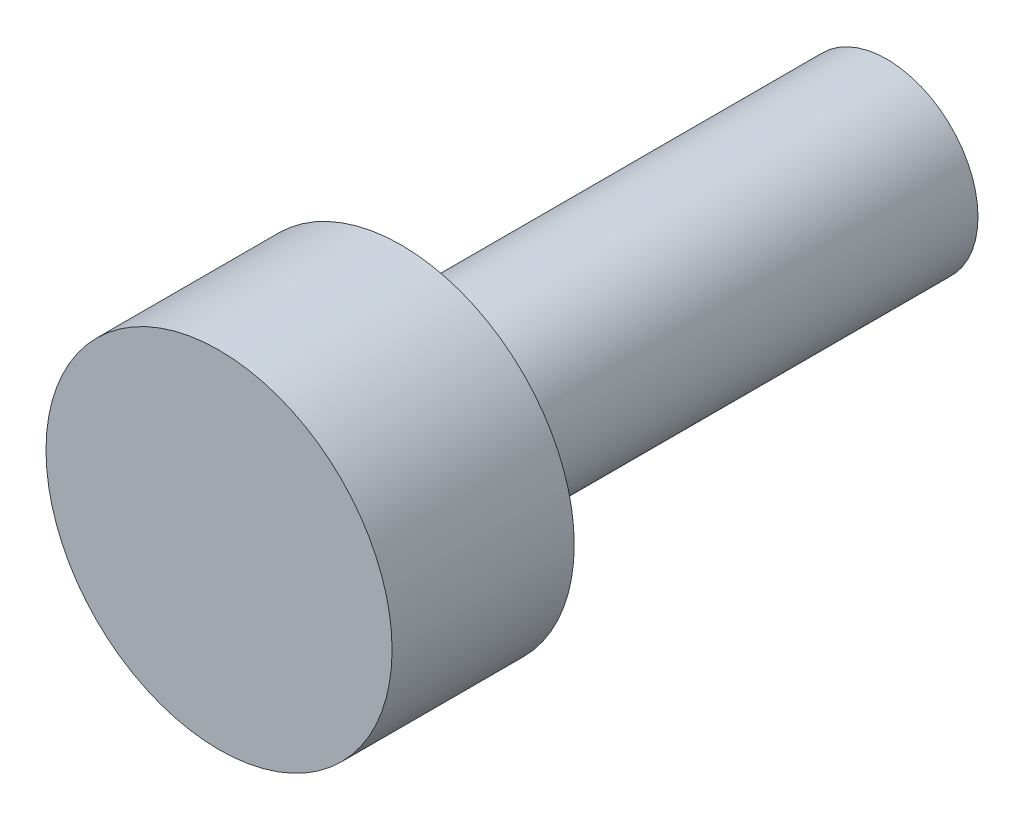
ISO-10303-21;
HEADER;
FILE_DESCRIPTION(('STEP AP214'),'2;1');
FILE_NAME('part.step','',(''),(''),'','','');
FILE_SCHEMA(('AUTOMOTIVE_DESIGN { 1 0 10303 214 1 1 1 1 }'));
ENDSEC;
DATA;
#1=APPLICATION_CONTEXT('core data for automotive mechanical design processes');
#2=APPLICATION_PROTOCOL_DEFINITION('international standard','automotive_design',2000,#1);
#3=PRODUCT_CONTEXT('',#1,'mechanical');
#4=PRODUCT('Part','Part','',(#3));
#5=PRODUCT_RELATED_PRODUCT_CATEGORY('part','',(#4));
#6=PRODUCT_DEFINITION_FORMATION('','',#4);
#7=PRODUCT_DEFINITION_CONTEXT('part definition',#1,'design');
#8=PRODUCT_DEFINITION('design','',#6,#7);
#9=PRODUCT_DEFINITION_SHAPE('','',#8);
#10=(LENGTH_UNIT() NAMED_UNIT(*) SI_UNIT(.MILLI.,.METRE.));
#11=(NAMED_UNIT(*) PLANE_ANGLE_UNIT() SI_UNIT($,.RADIAN.));
#12=(NAMED_UNIT(*) SI_UNIT($,.STERADIAN.) SOLID_ANGLE_UNIT());
#13=UNCERTAINTY_MEASURE_WITH_UNIT(LENGTH_MEASURE(1.E-05),#10,'distance_accuracy_value','');
#14=(GEOMETRIC_REPRESENTATION_CONTEXT(3) GLOBAL_UNCERTAINTY_ASSIGNED_CONTEXT((#13)) GLOBAL_UNIT_ASSIGNED_CONTEXT((#10,
#11,#12)) REPRESENTATION_CONTEXT('',''));
#15=CARTESIAN_POINT('',(0.,0.,0.));
#16=DIRECTION('',(0.,0.,1.));
#17=DIRECTION('',(1.,0.,0.));
#18=AXIS2_PLACEMENT_3D('',#15,#16,#17);
#19=CARTESIAN_POINT('',(0.,0.,8.));
#20=DIRECTION('',(0.,0.,-1.));
#21=DIRECTION('',(-1.,0.,0.));
#22=AXIS2_PLACEMENT_3D('',#19,#20,#21);
#23=CYLINDRICAL_SURFACE('',#22,1.5);
#24=CARTESIAN_POINT('',(0.,0.,8.));
#25=DIRECTION('',(0.,0.,1.));
#26=DIRECTION('',(1.,0.,0.));
#27=AXIS2_PLACEMENT_3D('',#24,#25,#26);
#28=CIRCLE('',#27,1.5);
#29=CARTESIAN_POINT('',(1.5,0.,8.));
#30=VERTEX_POINT('',#29);
#31=EDGE_CURVE('E10',#30,#30,#28,.T.);
#32=ORIENTED_EDGE('',*,*,#31,.F.);
#33=EDGE_LOOP('',(#32));
#34=FACE_BOUND('',#33,.T.);
#35=CARTESIAN_POINT('',(0.,0.,0.));
#36=DIRECTION('',(0.,0.,1.));
#37=DIRECTION('',(1.,0.,0.));
#38=AXIS2_PLACEMENT_3D('',#35,#36,#37);
#39=CIRCLE('',#38,1.5);
#40=CARTESIAN_POINT('',(1.5,0.,0.));
#41=VERTEX_POINT('',#40);
#42=EDGE_CURVE('E34',#41,#41,#39,.T.);
#43=ORIENTED_EDGE('',*,*,#42,.T.);
#44=EDGE_LOOP('',(#43));
#45=FACE_BOUND('',#44,.T.);
#46=ADVANCED_FACE('F31',(#34,#45),#23,.T.);
#47=CARTESIAN_POINT('',(0.,0.,0.));
#48=DIRECTION('',(0.,0.,1.));
#49=DIRECTION('',(1.,0.,0.));
#50=AXIS2_PLACEMENT_3D('',#47,#48,#49);
#51=PLANE('',#50);
#52=ORIENTED_EDGE('',*,*,#42,.F.);
#53=EDGE_LOOP('',(#52));
#54=FACE_BOUND('',#53,.T.);
#55=ADVANCED_FACE('F54',(#54),#51,.F.);
#56=CARTESIAN_POINT('',(0.,0.,11.));
#57=DIRECTION('',(0.,0.,-1.));
#58=DIRECTION('',(-1.,0.,0.));
#59=AXIS2_PLACEMENT_3D('',#56,#57,#58);
#60=CYLINDRICAL_SURFACE('',#59,2.85);
#61=CARTESIAN_POINT('',(0.,0.,11.));
#62=DIRECTION('',(0.,0.,1.));
#63=DIRECTION('',(1.,0.,0.));
#64=AXIS2_PLACEMENT_3D('',#61,#62,#63);
#65=CIRCLE('',#64,2.85);
#66=CARTESIAN_POINT('',(2.85,0.,11.));
#67=VERTEX_POINT('',#66);
#68=EDGE_CURVE('E41',#67,#67,#65,.T.);
#69=ORIENTED_EDGE('',*,*,#68,.F.);
#70=EDGE_LOOP('',(#69));
#71=FACE_BOUND('',#70,.T.);
#72=CARTESIAN_POINT('',(0.,0.,8.));
#73=DIRECTION('',(0.,0.,1.));
#74=DIRECTION('',(1.,0.,0.));
#75=AXIS2_PLACEMENT_3D('',#72,#73,#74);
#76=CIRCLE('',#75,2.85);
#77=CARTESIAN_POINT('',(2.85,0.,8.));
#78=VERTEX_POINT('',#77);
#79=EDGE_CURVE('E43',#78,#78,#76,.T.);
#80=ORIENTED_EDGE('',*,*,#79,.T.);
#81=EDGE_LOOP('',(#80));
#82=FACE_BOUND('',#81,.T.);
#83=ADVANCED_FACE('F51',(#71,#82),#60,.T.);
#84=CARTESIAN_POINT('',(0.,0.,11.));
#85=DIRECTION('',(0.,0.,1.));
#86=DIRECTION('',(1.,0.,0.));
#87=AXIS2_PLACEMENT_3D('',#84,#85,#86);
#88=PLANE('',#87);
#89=ORIENTED_EDGE('',*,*,#68,.T.);
#90=EDGE_LOOP('',(#89));
#91=FACE_BOUND('',#90,.T.);
#92=ADVANCED_FACE('F49',(#91),#88,.T.);
#93=CARTESIAN_POINT('',(0.,0.,8.));
#94=DIRECTION('',(0.,0.,1.));
#95=DIRECTION('',(1.,0.,0.));
#96=AXIS2_PLACEMENT_3D('',#93,#94,#95);
#97=PLANE('',#96);
#98=ORIENTED_EDGE('',*,*,#31,.T.);
#99=EDGE_LOOP('',(#98));
#100=FACE_BOUND('',#99,.T.);
#101=ORIENTED_EDGE('',*,*,#79,.F.);
#102=EDGE_LOOP('',(#101));
#103=FACE_BOUND('',#102,.T.);
#104=ADVANCED_FACE('F58',(#100,#103),#97,.F.);
#105=CLOSED_SHELL('',(#46,#55,#83,#92,#104));
#106=MANIFOLD_SOLID_BREP('B2',#105);
#107=ADVANCED_BREP_SHAPE_REPRESENTATION('',(#18,#106),#14);
#108=SHAPE_DEFINITION_REPRESENTATION(#9,#107);
ENDSEC;
END-ISO-10303-21;
